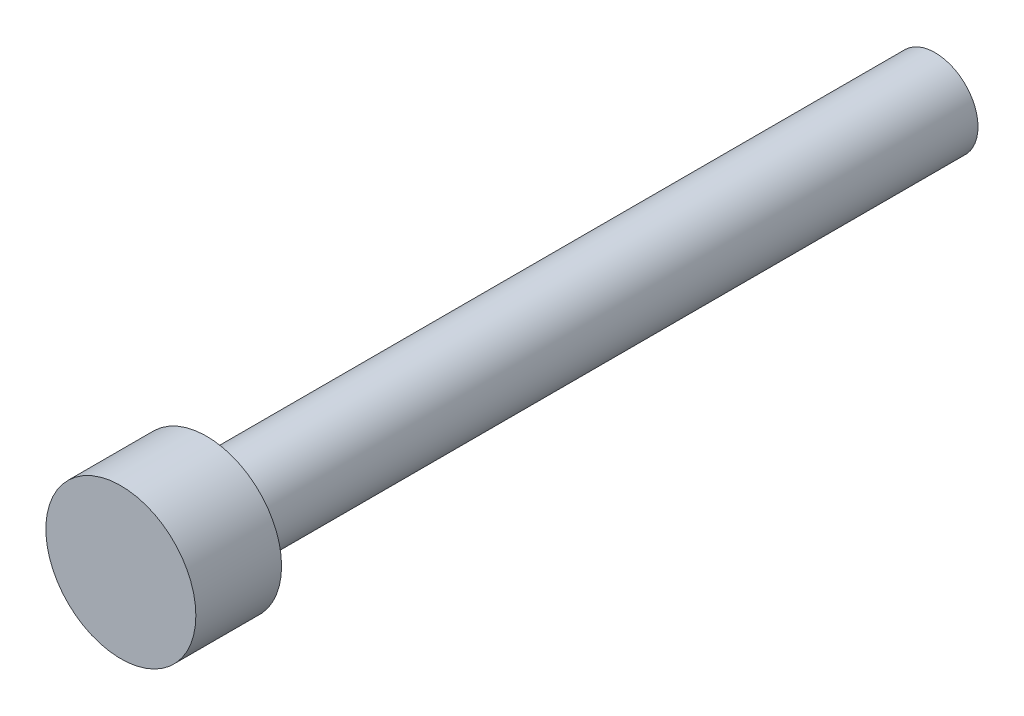
ISO-10303-21;
HEADER;
FILE_DESCRIPTION(('STEP AP214'),'2;1');
FILE_NAME('part.step','',(''),(''),'','','');
FILE_SCHEMA(('AUTOMOTIVE_DESIGN { 1 0 10303 214 1 1 1 1 }'));
ENDSEC;
DATA;
#1=APPLICATION_CONTEXT('core data for automotive mechanical design processes');
#2=APPLICATION_PROTOCOL_DEFINITION('international standard','automotive_design',2000,#1);
#3=PRODUCT_CONTEXT('',#1,'mechanical');
#4=PRODUCT('Part','Part','',(#3));
#5=PRODUCT_RELATED_PRODUCT_CATEGORY('part','',(#4));
#6=PRODUCT_DEFINITION_FORMATION('','',#4);
#7=PRODUCT_DEFINITION_CONTEXT('part definition',#1,'design');
#8=PRODUCT_DEFINITION('design','',#6,#7);
#9=PRODUCT_DEFINITION_SHAPE('','',#8);
#10=(LENGTH_UNIT() NAMED_UNIT(*) SI_UNIT(.MILLI.,.METRE.));
#11=(NAMED_UNIT(*) PLANE_ANGLE_UNIT() SI_UNIT($,.RADIAN.));
#12=(NAMED_UNIT(*) SI_UNIT($,.STERADIAN.) SOLID_ANGLE_UNIT());
#13=UNCERTAINTY_MEASURE_WITH_UNIT(LENGTH_MEASURE(1.E-05),#10,'distance_accuracy_value','');
#14=(GEOMETRIC_REPRESENTATION_CONTEXT(3) GLOBAL_UNCERTAINTY_ASSIGNED_CONTEXT((#13)) GLOBAL_UNIT_ASSIGNED_CONTEXT((#10,
#11,#12)) REPRESENTATION_CONTEXT('',''));
#15=CARTESIAN_POINT('',(0.,0.,0.));
#16=DIRECTION('',(0.,0.,1.));
#17=DIRECTION('',(1.,0.,0.));
#18=AXIS2_PLACEMENT_3D('',#15,#16,#17);
#19=CARTESIAN_POINT('',(0.,0.,34.));
#20=DIRECTION('',(0.,0.,-1.));
#21=DIRECTION('',(-1.,0.,0.));
#22=AXIS2_PLACEMENT_3D('',#19,#20,#21);
#23=CYLINDRICAL_SURFACE('',#22,2.);
#24=CARTESIAN_POINT('',(0.,0.,34.));
#25=DIRECTION('',(0.,0.,1.));
#26=DIRECTION('',(1.,0.,0.));
#27=AXIS2_PLACEMENT_3D('',#24,#25,#26);
#28=CIRCLE('',#27,2.);
#29=CARTESIAN_POINT('',(2.,0.,34.));
#30=VERTEX_POINT('',#29);
#31=EDGE_CURVE('E10',#30,#30,#28,.T.);
#32=ORIENTED_EDGE('',*,*,#31,.F.);
#33=EDGE_LOOP('',(#32));
#34=FACE_BOUND('',#33,.T.);
#35=CARTESIAN_POINT('',(0.,0.,0.));
#36=DIRECTION('',(0.,0.,1.));
#37=DIRECTION('',(1.,0.,0.));
#38=AXIS2_PLACEMENT_3D('',#35,#36,#37);
#39=CIRCLE('',#38,2.);
#40=CARTESIAN_POINT('',(2.,0.,0.));
#41=VERTEX_POINT('',#40);
#42=EDGE_CURVE('E34',#41,#41,#39,.T.);
#43=ORIENTED_EDGE('',*,*,#42,.T.);
#44=EDGE_LOOP('',(#43));
#45=FACE_BOUND('',#44,.T.);
#46=ADVANCED_FACE('F31',(#34,#45),#23,.T.);
#47=CARTESIAN_POINT('',(0.,0.,0.));
#48=DIRECTION('',(0.,0.,1.));
#49=DIRECTION('',(1.,0.,0.));
#50=AXIS2_PLACEMENT_3D('',#47,#48,#49);
#51=PLANE('',#50);
#52=ORIENTED_EDGE('',*,*,#42,.F.);
#53=EDGE_LOOP('',(#52));
#54=FACE_BOUND('',#53,.T.);
#55=ADVANCED_FACE('F59',(#54),#51,.F.);
#56=CARTESIAN_POINT('',(0.,0.,34.));
#57=DIRECTION('',(0.,0.,1.));
#58=DIRECTION('',(1.,0.,0.));
#59=AXIS2_PLACEMENT_3D('',#56,#57,#58);
#60=PLANE('',#59);
#61=CARTESIAN_POINT('',(0.,0.,34.));
#62=DIRECTION('',(0.,0.,1.));
#63=DIRECTION('',(1.,0.,0.));
#64=AXIS2_PLACEMENT_3D('',#61,#62,#63);
#65=CIRCLE('',#64,3.5);
#66=CARTESIAN_POINT('',(3.5,0.,34.));
#67=VERTEX_POINT('',#66);
#68=EDGE_CURVE('E43',#67,#67,#65,.T.);
#69=ORIENTED_EDGE('',*,*,#68,.F.);
#70=EDGE_LOOP('',(#69));
#71=FACE_BOUND('',#70,.T.);
#72=ORIENTED_EDGE('',*,*,#31,.T.);
#73=EDGE_LOOP('',(#72));
#74=FACE_BOUND('',#73,.T.);
#75=ADVANCED_FACE('F54',(#71,#74),#60,.F.);
#76=CARTESIAN_POINT('',(0.,0.,38.));
#77=DIRECTION('',(0.,0.,-1.));
#78=DIRECTION('',(-1.,0.,0.));
#79=AXIS2_PLACEMENT_3D('',#76,#77,#78);
#80=CYLINDRICAL_SURFACE('',#79,3.5);
#81=CARTESIAN_POINT('',(0.,0.,38.));
#82=DIRECTION('',(0.,0.,1.));
#83=DIRECTION('',(1.,0.,0.));
#84=AXIS2_PLACEMENT_3D('',#81,#82,#83);
#85=CIRCLE('',#84,3.5);
#86=CARTESIAN_POINT('',(3.5,0.,38.));
#87=VERTEX_POINT('',#86);
#88=EDGE_CURVE('E41',#87,#87,#85,.T.);
#89=ORIENTED_EDGE('',*,*,#88,.F.);
#90=EDGE_LOOP('',(#89));
#91=FACE_BOUND('',#90,.T.);
#92=ORIENTED_EDGE('',*,*,#68,.T.);
#93=EDGE_LOOP('',(#92));
#94=FACE_BOUND('',#93,.T.);
#95=ADVANCED_FACE('F51',(#91,#94),#80,.T.);
#96=CARTESIAN_POINT('',(0.,0.,38.));
#97=DIRECTION('',(0.,0.,1.));
#98=DIRECTION('',(1.,0.,0.));
#99=AXIS2_PLACEMENT_3D('',#96,#97,#98);
#100=PLANE('',#99);
#101=ORIENTED_EDGE('',*,*,#88,.T.);
#102=EDGE_LOOP('',(#101));
#103=FACE_BOUND('',#102,.T.);
#104=ADVANCED_FACE('F49',(#103),#100,.T.);
#105=CLOSED_SHELL('',(#46,#55,#75,#95,#104));
#106=MANIFOLD_SOLID_BREP('B2',#105);
#107=ADVANCED_BREP_SHAPE_REPRESENTATION('',(#18,#106),#14);
#108=SHAPE_DEFINITION_REPRESENTATION(#9,#107);
ENDSEC;
END-ISO-10303-21;
